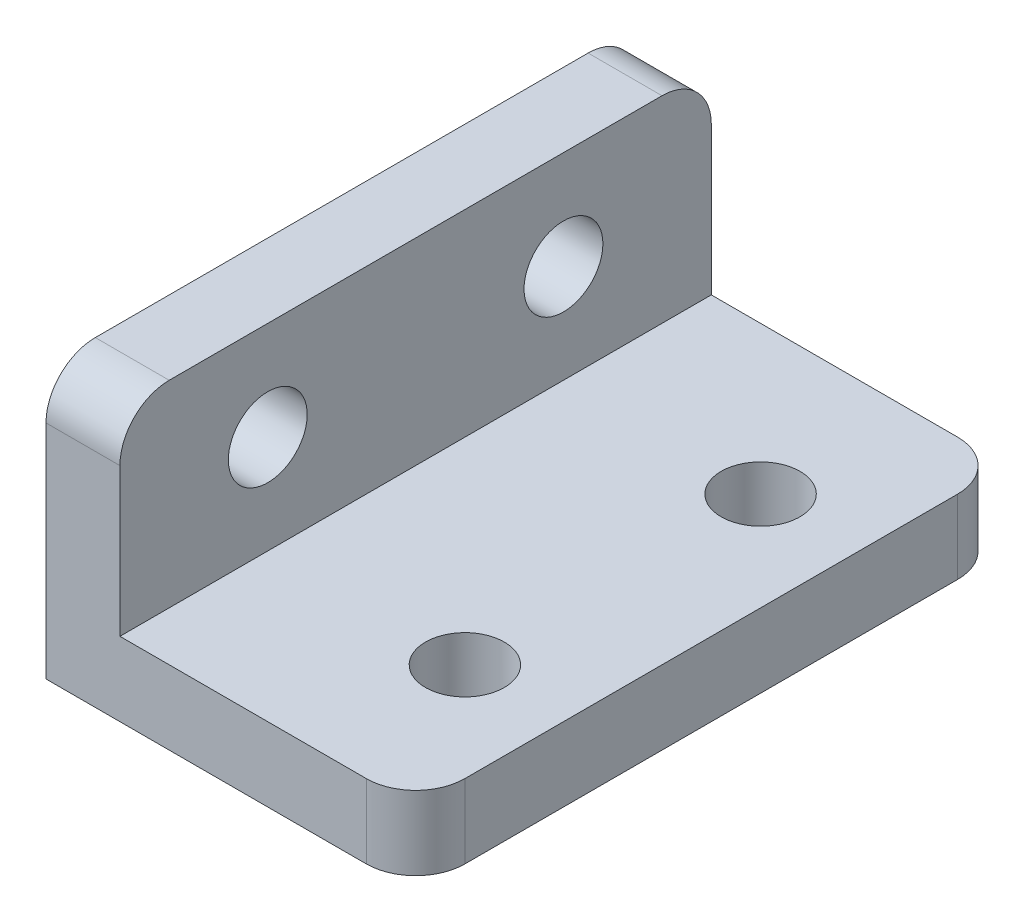
ISO-10303-21;
HEADER;
FILE_DESCRIPTION(('STEP AP214'),'2;1');
FILE_NAME('part.step','',(''),(''),'','','');
FILE_SCHEMA(('AUTOMOTIVE_DESIGN { 1 0 10303 214 1 1 1 1 }'));
ENDSEC;
DATA;
#1=APPLICATION_CONTEXT('core data for automotive mechanical design processes');
#2=APPLICATION_PROTOCOL_DEFINITION('international standard','automotive_design',2000,#1);
#3=PRODUCT_CONTEXT('',#1,'mechanical');
#4=PRODUCT('Part','Part','',(#3));
#5=PRODUCT_RELATED_PRODUCT_CATEGORY('part','',(#4));
#6=PRODUCT_DEFINITION_FORMATION('','',#4);
#7=PRODUCT_DEFINITION_CONTEXT('part definition',#1,'design');
#8=PRODUCT_DEFINITION('design','',#6,#7);
#9=PRODUCT_DEFINITION_SHAPE('','',#8);
#10=(LENGTH_UNIT() NAMED_UNIT(*) SI_UNIT(.MILLI.,.METRE.));
#11=(NAMED_UNIT(*) PLANE_ANGLE_UNIT() SI_UNIT($,.RADIAN.));
#12=(NAMED_UNIT(*) SI_UNIT($,.STERADIAN.) SOLID_ANGLE_UNIT());
#13=UNCERTAINTY_MEASURE_WITH_UNIT(LENGTH_MEASURE(1.E-05),#10,'distance_accuracy_value','');
#14=(GEOMETRIC_REPRESENTATION_CONTEXT(3) GLOBAL_UNCERTAINTY_ASSIGNED_CONTEXT((#13)) GLOBAL_UNIT_ASSIGNED_CONTEXT((#10,
#11,#12)) REPRESENTATION_CONTEXT('',''));
#15=CARTESIAN_POINT('',(0.,0.,0.));
#16=DIRECTION('',(0.,0.,1.));
#17=DIRECTION('',(1.,0.,0.));
#18=AXIS2_PLACEMENT_3D('',#15,#16,#17);
#19=CARTESIAN_POINT('',(9.40836507358763E-13,101.691622654979,-24.));
#20=DIRECTION('',(0.,-1.,0.));
#21=DIRECTION('',(1.,0.,0.));
#22=AXIS2_PLACEMENT_3D('',#19,#20,#21);
#23=PLANE('',#22);
#24=CARTESIAN_POINT('',(14.,101.691622654979,-6.));
#25=DIRECTION('',(0.,-1.,0.));
#26=DIRECTION('',(1.,0.,0.));
#27=AXIS2_PLACEMENT_3D('',#24,#25,#26);
#28=CIRCLE('',#27,1.60000000001785);
#29=CARTESIAN_POINT('',(15.6000000000178,101.691622654979,-6.));
#30=VERTEX_POINT('',#29);
#31=EDGE_CURVE('E382',#30,#30,#28,.T.);
#32=ORIENTED_EDGE('',*,*,#31,.F.);
#33=EDGE_LOOP('',(#32));
#34=FACE_BOUND('',#33,.T.);
#35=CARTESIAN_POINT('',(14.,101.691622654979,-18.));
#36=DIRECTION('',(0.,-1.,0.));
#37=DIRECTION('',(1.,0.,0.));
#38=AXIS2_PLACEMENT_3D('',#35,#36,#37);
#39=CIRCLE('',#38,1.60000000001785);
#40=CARTESIAN_POINT('',(15.6000000000178,101.691622654979,-18.));
#41=VERTEX_POINT('',#40);
#42=EDGE_CURVE('E387',#41,#41,#39,.T.);
#43=ORIENTED_EDGE('',*,*,#42,.F.);
#44=EDGE_LOOP('',(#43));
#45=FACE_BOUND('',#44,.T.);
#46=DIRECTION('',(1.,0.,0.));
#47=VECTOR('',#46,1.);
#48=CARTESIAN_POINT('',(9.40836507358763E-13,101.691622654979,-24.));
#49=LINE('',#48,#47);
#50=CARTESIAN_POINT('',(3.0000000000001,101.691622654979,-24.));
#51=VERTEX_POINT('',#50);
#52=CARTESIAN_POINT('',(16.,101.691622654979,-24.));
#53=VERTEX_POINT('',#52);
#54=EDGE_CURVE('E153',#51,#53,#49,.T.);
#55=ORIENTED_EDGE('',*,*,#54,.T.);
#56=CARTESIAN_POINT('',(16.,101.691622654979,-22.));
#57=DIRECTION('',(0.,-1.,0.));
#58=DIRECTION('',(1.,0.,0.));
#59=AXIS2_PLACEMENT_3D('',#56,#57,#58);
#60=CIRCLE('',#59,2.);
#61=CARTESIAN_POINT('',(18.,101.691622654979,-22.));
#62=VERTEX_POINT('',#61);
#63=EDGE_CURVE('E194',#53,#62,#60,.T.);
#64=ORIENTED_EDGE('',*,*,#63,.T.);
#65=DIRECTION('',(0.,0.,1.));
#66=VECTOR('',#65,1.);
#67=CARTESIAN_POINT('',(18.,101.691622654979,-24.));
#68=LINE('',#67,#66);
#69=CARTESIAN_POINT('',(18.,101.691622654979,-2.));
#70=VERTEX_POINT('',#69);
#71=EDGE_CURVE('E161',#62,#70,#68,.T.);
#72=ORIENTED_EDGE('',*,*,#71,.T.);
#73=CARTESIAN_POINT('',(16.,101.691622654979,-2.));
#74=DIRECTION('',(0.,-1.,0.));
#75=DIRECTION('',(1.,0.,0.));
#76=AXIS2_PLACEMENT_3D('',#73,#74,#75);
#77=CIRCLE('',#76,2.);
#78=CARTESIAN_POINT('',(16.,101.691622654979,0.));
#79=VERTEX_POINT('',#78);
#80=EDGE_CURVE('E192',#70,#79,#77,.T.);
#81=ORIENTED_EDGE('',*,*,#80,.T.);
#82=DIRECTION('',(1.,0.,0.));
#83=VECTOR('',#82,1.);
#84=CARTESIAN_POINT('',(9.40836507358763E-13,101.691622654979,0.));
#85=LINE('',#84,#83);
#86=CARTESIAN_POINT('',(3.0000000000001,101.691622654979,0.));
#87=VERTEX_POINT('',#86);
#88=EDGE_CURVE('E162',#87,#79,#85,.T.);
#89=ORIENTED_EDGE('',*,*,#88,.F.);
#90=DIRECTION('',(0.,0.,1.));
#91=VECTOR('',#90,1.);
#92=CARTESIAN_POINT('',(3.0000000000001,101.691622654979,-24.));
#93=LINE('',#92,#91);
#94=EDGE_CURVE('E170',#51,#87,#93,.T.);
#95=ORIENTED_EDGE('',*,*,#94,.F.);
#96=EDGE_LOOP('',(#55,#64,#72,#81,#89,#95));
#97=FACE_BOUND('',#96,.T.);
#98=ADVANCED_FACE('F49',(#34,#45,#97),#23,.T.);
#99=CARTESIAN_POINT('',(3.00000000000058,0.,-24.));
#100=DIRECTION('',(-1.,0.,0.));
#101=DIRECTION('',(0.,-1.,0.));
#102=AXIS2_PLACEMENT_3D('',#99,#100,#101);
#103=PLANE('',#102);
#104=CARTESIAN_POINT('',(3.00000000000007,108.691622654979,-6.));
#105=DIRECTION('',(-1.,0.,0.));
#106=DIRECTION('',(0.,-1.,0.));
#107=AXIS2_PLACEMENT_3D('',#104,#105,#106);
#108=CIRCLE('',#107,1.60000000000001);
#109=CARTESIAN_POINT('',(3.00000000000008,107.091622654979,-6.));
#110=VERTEX_POINT('',#109);
#111=EDGE_CURVE('E166',#110,#110,#108,.T.);
#112=ORIENTED_EDGE('',*,*,#111,.F.);
#113=EDGE_LOOP('',(#112));
#114=FACE_BOUND('',#113,.T.);
#115=CARTESIAN_POINT('',(3.00000000000007,108.691622654979,-18.));
#116=DIRECTION('',(-1.,0.,0.));
#117=DIRECTION('',(0.,-1.,0.));
#118=AXIS2_PLACEMENT_3D('',#115,#116,#117);
#119=CIRCLE('',#118,1.60000000000001);
#120=CARTESIAN_POINT('',(3.00000000000008,107.091622654979,-18.));
#121=VERTEX_POINT('',#120);
#122=EDGE_CURVE('E384',#121,#121,#119,.T.);
#123=ORIENTED_EDGE('',*,*,#122,.F.);
#124=EDGE_LOOP('',(#123));
#125=FACE_BOUND('',#124,.T.);
#126=DIRECTION('',(0.,0.,1.));
#127=VECTOR('',#126,1.);
#128=CARTESIAN_POINT('',(3.00000000000005,112.691622654979,-24.));
#129=LINE('',#128,#127);
#130=CARTESIAN_POINT('',(3.00000000000005,112.691622654979,-22.));
#131=VERTEX_POINT('',#130);
#132=CARTESIAN_POINT('',(3.00000000000005,112.691622654979,-2.));
#133=VERTEX_POINT('',#132);
#134=EDGE_CURVE('E174',#131,#133,#129,.T.);
#135=ORIENTED_EDGE('',*,*,#134,.F.);
#136=CARTESIAN_POINT('',(3.00000000000006,110.691622654979,-22.));
#137=DIRECTION('',(-1.,0.,0.));
#138=DIRECTION('',(0.,-1.,0.));
#139=AXIS2_PLACEMENT_3D('',#136,#137,#138);
#140=CIRCLE('',#139,2.);
#141=CARTESIAN_POINT('',(3.00000000000006,110.691622654979,-24.));
#142=VERTEX_POINT('',#141);
#143=EDGE_CURVE('E13',#131,#142,#140,.T.);
#144=ORIENTED_EDGE('',*,*,#143,.T.);
#145=DIRECTION('',(0.,-1.,0.));
#146=VECTOR('',#145,1.);
#147=CARTESIAN_POINT('',(3.00000000000058,0.,-24.));
#148=LINE('',#147,#146);
#149=EDGE_CURVE('E137',#142,#51,#148,.T.);
#150=ORIENTED_EDGE('',*,*,#149,.T.);
#151=ORIENTED_EDGE('',*,*,#94,.T.);
#152=DIRECTION('',(0.,-1.,0.));
#153=VECTOR('',#152,1.);
#154=CARTESIAN_POINT('',(3.00000000000058,0.,0.));
#155=LINE('',#154,#153);
#156=CARTESIAN_POINT('',(3.00000000000006,110.691622654979,0.));
#157=VERTEX_POINT('',#156);
#158=EDGE_CURVE('E156',#157,#87,#155,.T.);
#159=ORIENTED_EDGE('',*,*,#158,.F.);
#160=CARTESIAN_POINT('',(3.00000000000006,110.691622654979,-2.));
#161=DIRECTION('',(-1.,0.,0.));
#162=DIRECTION('',(0.,-1.,0.));
#163=AXIS2_PLACEMENT_3D('',#160,#161,#162);
#164=CIRCLE('',#163,2.);
#165=EDGE_CURVE('E57',#157,#133,#164,.T.);
#166=ORIENTED_EDGE('',*,*,#165,.T.);
#167=EDGE_LOOP('',(#135,#144,#150,#151,#159,#166));
#168=FACE_BOUND('',#167,.T.);
#169=ADVANCED_FACE('F214',(#114,#125,#168),#103,.T.);
#170=CARTESIAN_POINT('',(0.,112.691622654979,-24.));
#171=DIRECTION('',(0.,-1.,0.));
#172=DIRECTION('',(0.,0.,-1.));
#173=AXIS2_PLACEMENT_3D('',#170,#171,#172);
#174=PLANE('',#173);
#175=DIRECTION('',(0.,0.,1.));
#176=VECTOR('',#175,1.);
#177=CARTESIAN_POINT('',(6.00000000000005,112.691622654979,-24.));
#178=LINE('',#177,#176);
#179=CARTESIAN_POINT('',(6.00000000000005,112.691622654979,-22.));
#180=VERTEX_POINT('',#179);
#181=CARTESIAN_POINT('',(6.00000000000005,112.691622654979,-2.));
#182=VERTEX_POINT('',#181);
#183=EDGE_CURVE('E147',#180,#182,#178,.T.);
#184=ORIENTED_EDGE('',*,*,#183,.F.);
#185=DIRECTION('',(1.,0.,0.));
#186=VECTOR('',#185,1.);
#187=CARTESIAN_POINT('',(0.,112.691622654979,-22.));
#188=LINE('',#187,#186);
#189=EDGE_CURVE('E70',#180,#131,#188,.F.);
#190=ORIENTED_EDGE('',*,*,#189,.T.);
#191=ORIENTED_EDGE('',*,*,#134,.T.);
#192=DIRECTION('',(1.,0.,0.));
#193=VECTOR('',#192,1.);
#194=CARTESIAN_POINT('',(6.00000000000005,112.691622654979,-2.));
#195=LINE('',#194,#193);
#196=EDGE_CURVE('E205',#133,#182,#195,.T.);
#197=ORIENTED_EDGE('',*,*,#196,.T.);
#198=EDGE_LOOP('',(#184,#190,#191,#197));
#199=FACE_BOUND('',#198,.T.);
#200=ADVANCED_FACE('F209',(#199),#174,.F.);
#201=CARTESIAN_POINT('',(6.00000000000006,0.,-24.));
#202=DIRECTION('',(-1.,0.,0.));
#203=DIRECTION('',(0.,-1.,0.));
#204=AXIS2_PLACEMENT_3D('',#201,#202,#203);
#205=PLANE('',#204);
#206=CARTESIAN_POINT('',(6.00000000000005,108.691622654979,-6.));
#207=DIRECTION('',(1.,0.,0.));
#208=DIRECTION('',(0.,1.,0.));
#209=AXIS2_PLACEMENT_3D('',#206,#207,#208);
#210=CIRCLE('',#209,1.60000000000001);
#211=CARTESIAN_POINT('',(6.00000000000005,110.291622654979,-6.));
#212=VERTEX_POINT('',#211);
#213=EDGE_CURVE('E377',#212,#212,#210,.T.);
#214=ORIENTED_EDGE('',*,*,#213,.F.);
#215=EDGE_LOOP('',(#214));
#216=FACE_BOUND('',#215,.T.);
#217=CARTESIAN_POINT('',(6.00000000000005,108.691622654979,-18.));
#218=DIRECTION('',(1.,0.,0.));
#219=DIRECTION('',(0.,1.,0.));
#220=AXIS2_PLACEMENT_3D('',#217,#218,#219);
#221=CIRCLE('',#220,1.60000000000001);
#222=CARTESIAN_POINT('',(6.00000000000005,110.291622654979,-18.));
#223=VERTEX_POINT('',#222);
#224=EDGE_CURVE('E380',#223,#223,#221,.T.);
#225=ORIENTED_EDGE('',*,*,#224,.F.);
#226=EDGE_LOOP('',(#225));
#227=FACE_BOUND('',#226,.T.);
#228=DIRECTION('',(0.,-1.,0.));
#229=VECTOR('',#228,1.);
#230=CARTESIAN_POINT('',(6.00000000000006,0.,-24.));
#231=LINE('',#230,#229);
#232=CARTESIAN_POINT('',(6.00000000000005,110.691622654979,-24.));
#233=VERTEX_POINT('',#232);
#234=CARTESIAN_POINT('',(6.00000000000005,104.691622654979,-24.));
#235=VERTEX_POINT('',#234);
#236=EDGE_CURVE('E127',#233,#235,#231,.T.);
#237=ORIENTED_EDGE('',*,*,#236,.F.);
#238=CARTESIAN_POINT('',(6.00000000000005,110.691622654979,-22.));
#239=DIRECTION('',(-1.,0.,0.));
#240=DIRECTION('',(0.,-1.,0.));
#241=AXIS2_PLACEMENT_3D('',#238,#239,#240);
#242=CIRCLE('',#241,2.);
#243=EDGE_CURVE('E203',#233,#180,#242,.F.);
#244=ORIENTED_EDGE('',*,*,#243,.T.);
#245=ORIENTED_EDGE('',*,*,#183,.T.);
#246=CARTESIAN_POINT('',(6.00000000000005,110.691622654979,-2.));
#247=DIRECTION('',(-1.,0.,0.));
#248=DIRECTION('',(0.,-1.,0.));
#249=AXIS2_PLACEMENT_3D('',#246,#247,#248);
#250=CIRCLE('',#249,2.);
#251=CARTESIAN_POINT('',(6.00000000000005,110.691622654979,0.));
#252=VERTEX_POINT('',#251);
#253=EDGE_CURVE('E201',#182,#252,#250,.F.);
#254=ORIENTED_EDGE('',*,*,#253,.T.);
#255=DIRECTION('',(0.,-1.,0.));
#256=VECTOR('',#255,1.);
#257=CARTESIAN_POINT('',(6.00000000000006,0.,0.));
#258=LINE('',#257,#256);
#259=CARTESIAN_POINT('',(6.00000000000005,104.691622654979,0.));
#260=VERTEX_POINT('',#259);
#261=EDGE_CURVE('E143',#252,#260,#258,.T.);
#262=ORIENTED_EDGE('',*,*,#261,.T.);
#263=DIRECTION('',(0.,0.,1.));
#264=VECTOR('',#263,1.);
#265=CARTESIAN_POINT('',(6.00000000000005,104.691622654979,-24.));
#266=LINE('',#265,#264);
#267=EDGE_CURVE('E140',#235,#260,#266,.T.);
#268=ORIENTED_EDGE('',*,*,#267,.F.);
#269=EDGE_LOOP('',(#237,#244,#245,#254,#262,#268));
#270=FACE_BOUND('',#269,.T.);
#271=ADVANCED_FACE('F141',(#216,#227,#270),#205,.F.);
#272=CARTESIAN_POINT('',(0.,104.691622654979,-24.));
#273=DIRECTION('',(0.,-1.,0.));
#274=DIRECTION('',(0.,0.,-1.));
#275=AXIS2_PLACEMENT_3D('',#272,#273,#274);
#276=PLANE('',#275);
#277=CARTESIAN_POINT('',(14.,104.691622654979,-6.));
#278=DIRECTION('',(0.,1.,0.));
#279=DIRECTION('',(-1.,0.,0.));
#280=AXIS2_PLACEMENT_3D('',#277,#278,#279);
#281=CIRCLE('',#280,1.60000000001785);
#282=CARTESIAN_POINT('',(12.3999999999821,104.691622654979,-6.));
#283=VERTEX_POINT('',#282);
#284=EDGE_CURVE('E399',#283,#283,#281,.T.);
#285=ORIENTED_EDGE('',*,*,#284,.F.);
#286=EDGE_LOOP('',(#285));
#287=FACE_BOUND('',#286,.T.);
#288=CARTESIAN_POINT('',(14.,104.691622654979,-18.));
#289=DIRECTION('',(0.,1.,0.));
#290=DIRECTION('',(-1.,0.,0.));
#291=AXIS2_PLACEMENT_3D('',#288,#289,#290);
#292=CIRCLE('',#291,1.60000000001785);
#293=CARTESIAN_POINT('',(12.3999999999821,104.691622654979,-18.));
#294=VERTEX_POINT('',#293);
#295=EDGE_CURVE('E400',#294,#294,#292,.T.);
#296=ORIENTED_EDGE('',*,*,#295,.F.);
#297=EDGE_LOOP('',(#296));
#298=FACE_BOUND('',#297,.T.);
#299=DIRECTION('',(0.,0.,1.));
#300=VECTOR('',#299,1.);
#301=CARTESIAN_POINT('',(18.,104.691622654979,-24.));
#302=LINE('',#301,#300);
#303=CARTESIAN_POINT('',(18.,104.691622654979,-22.));
#304=VERTEX_POINT('',#303);
#305=CARTESIAN_POINT('',(18.,104.691622654979,-2.));
#306=VERTEX_POINT('',#305);
#307=EDGE_CURVE('E148',#304,#306,#302,.T.);
#308=ORIENTED_EDGE('',*,*,#307,.F.);
#309=CARTESIAN_POINT('',(16.,104.691622654979,-22.));
#310=DIRECTION('',(0.,-1.,0.));
#311=DIRECTION('',(0.,0.,-1.));
#312=AXIS2_PLACEMENT_3D('',#309,#310,#311);
#313=CIRCLE('',#312,2.);
#314=CARTESIAN_POINT('',(16.,104.691622654979,-24.));
#315=VERTEX_POINT('',#314);
#316=EDGE_CURVE('E152',#304,#315,#313,.F.);
#317=ORIENTED_EDGE('',*,*,#316,.T.);
#318=DIRECTION('',(1.,0.,0.));
#319=VECTOR('',#318,1.);
#320=CARTESIAN_POINT('',(0.,104.691622654979,-24.));
#321=LINE('',#320,#319);
#322=EDGE_CURVE('E131',#235,#315,#321,.T.);
#323=ORIENTED_EDGE('',*,*,#322,.F.);
#324=ORIENTED_EDGE('',*,*,#267,.T.);
#325=DIRECTION('',(1.,0.,0.));
#326=VECTOR('',#325,1.);
#327=CARTESIAN_POINT('',(0.,104.691622654979,0.));
#328=LINE('',#327,#326);
#329=CARTESIAN_POINT('',(16.,104.691622654979,0.));
#330=VERTEX_POINT('',#329);
#331=EDGE_CURVE('E165',#260,#330,#328,.T.);
#332=ORIENTED_EDGE('',*,*,#331,.T.);
#333=CARTESIAN_POINT('',(16.,104.691622654979,-2.));
#334=DIRECTION('',(0.,-1.,0.));
#335=DIRECTION('',(0.,0.,-1.));
#336=AXIS2_PLACEMENT_3D('',#333,#334,#335);
#337=CIRCLE('',#336,2.);
#338=EDGE_CURVE('E186',#330,#306,#337,.F.);
#339=ORIENTED_EDGE('',*,*,#338,.T.);
#340=EDGE_LOOP('',(#308,#317,#323,#324,#332,#339));
#341=FACE_BOUND('',#340,.T.);
#342=ADVANCED_FACE('F151',(#287,#298,#341),#276,.F.);
#343=CARTESIAN_POINT('',(18.,0.,-24.));
#344=DIRECTION('',(1.,0.,0.));
#345=DIRECTION('',(0.,0.,-1.));
#346=AXIS2_PLACEMENT_3D('',#343,#344,#345);
#347=PLANE('',#346);
#348=ORIENTED_EDGE('',*,*,#71,.F.);
#349=DIRECTION('',(0.,1.,0.));
#350=VECTOR('',#349,1.);
#351=CARTESIAN_POINT('',(18.,104.691622654979,-22.));
#352=LINE('',#351,#350);
#353=EDGE_CURVE('E183',#62,#304,#352,.T.);
#354=ORIENTED_EDGE('',*,*,#353,.T.);
#355=ORIENTED_EDGE('',*,*,#307,.T.);
#356=DIRECTION('',(0.,1.,0.));
#357=VECTOR('',#356,1.);
#358=CARTESIAN_POINT('',(18.,0.,-2.));
#359=LINE('',#358,#357);
#360=EDGE_CURVE('E173',#306,#70,#359,.F.);
#361=ORIENTED_EDGE('',*,*,#360,.T.);
#362=EDGE_LOOP('',(#348,#354,#355,#361));
#363=FACE_BOUND('',#362,.T.);
#364=ADVANCED_FACE('F225',(#363),#347,.T.);
#365=CARTESIAN_POINT('',(0.,0.,-24.));
#366=DIRECTION('',(0.,0.,1.));
#367=DIRECTION('',(1.,0.,0.));
#368=AXIS2_PLACEMENT_3D('',#365,#366,#367);
#369=PLANE('',#368);
#370=ORIENTED_EDGE('',*,*,#322,.T.);
#371=DIRECTION('',(0.,1.,0.));
#372=VECTOR('',#371,1.);
#373=CARTESIAN_POINT('',(16.,101.691622654979,-24.));
#374=LINE('',#373,#372);
#375=EDGE_CURVE('E190',#315,#53,#374,.F.);
#376=ORIENTED_EDGE('',*,*,#375,.T.);
#377=ORIENTED_EDGE('',*,*,#54,.F.);
#378=ORIENTED_EDGE('',*,*,#149,.F.);
#379=DIRECTION('',(1.,0.,0.));
#380=VECTOR('',#379,1.);
#381=CARTESIAN_POINT('',(0.,110.691622654979,-24.));
#382=LINE('',#381,#380);
#383=EDGE_CURVE('E135',#142,#233,#382,.T.);
#384=ORIENTED_EDGE('',*,*,#383,.T.);
#385=ORIENTED_EDGE('',*,*,#236,.T.);
#386=EDGE_LOOP('',(#370,#376,#377,#378,#384,#385));
#387=FACE_BOUND('',#386,.T.);
#388=ADVANCED_FACE('F129',(#387),#369,.F.);
#389=CARTESIAN_POINT('',(0.,0.,0.));
#390=DIRECTION('',(0.,0.,1.));
#391=DIRECTION('',(1.,0.,0.));
#392=AXIS2_PLACEMENT_3D('',#389,#390,#391);
#393=PLANE('',#392);
#394=ORIENTED_EDGE('',*,*,#88,.T.);
#395=DIRECTION('',(0.,1.,0.));
#396=VECTOR('',#395,1.);
#397=CARTESIAN_POINT('',(16.,0.,0.));
#398=LINE('',#397,#396);
#399=EDGE_CURVE('E198',#79,#330,#398,.T.);
#400=ORIENTED_EDGE('',*,*,#399,.T.);
#401=ORIENTED_EDGE('',*,*,#331,.F.);
#402=ORIENTED_EDGE('',*,*,#261,.F.);
#403=DIRECTION('',(1.,0.,0.));
#404=VECTOR('',#403,1.);
#405=CARTESIAN_POINT('',(3.00000000000005,110.691622654979,0.));
#406=LINE('',#405,#404);
#407=EDGE_CURVE('E196',#252,#157,#406,.F.);
#408=ORIENTED_EDGE('',*,*,#407,.T.);
#409=ORIENTED_EDGE('',*,*,#158,.T.);
#410=EDGE_LOOP('',(#394,#400,#401,#402,#408,#409));
#411=FACE_BOUND('',#410,.T.);
#412=ADVANCED_FACE('F232',(#411),#393,.T.);
#413=CARTESIAN_POINT('',(-18.,108.691622654979,-18.));
#414=DIRECTION('',(1.,0.,0.));
#415=DIRECTION('',(0.,1.,0.));
#416=AXIS2_PLACEMENT_3D('',#413,#414,#415);
#417=CYLINDRICAL_SURFACE('',#416,1.60000000000001);
#418=ORIENTED_EDGE('',*,*,#122,.T.);
#419=EDGE_LOOP('',(#418));
#420=FACE_BOUND('',#419,.T.);
#421=ORIENTED_EDGE('',*,*,#224,.T.);
#422=EDGE_LOOP('',(#421));
#423=FACE_BOUND('',#422,.T.);
#424=ADVANCED_FACE('F302',(#420,#423),#417,.F.);
#425=CARTESIAN_POINT('',(-18.,108.691622654979,-6.));
#426=DIRECTION('',(1.,0.,0.));
#427=DIRECTION('',(0.,1.,0.));
#428=AXIS2_PLACEMENT_3D('',#425,#426,#427);
#429=CYLINDRICAL_SURFACE('',#428,1.60000000000001);
#430=ORIENTED_EDGE('',*,*,#111,.T.);
#431=EDGE_LOOP('',(#430));
#432=FACE_BOUND('',#431,.T.);
#433=ORIENTED_EDGE('',*,*,#213,.T.);
#434=EDGE_LOOP('',(#433));
#435=FACE_BOUND('',#434,.T.);
#436=ADVANCED_FACE('F293',(#432,#435),#429,.F.);
#437=CARTESIAN_POINT('',(14.,80.6916226549791,-18.));
#438=DIRECTION('',(0.,1.,0.));
#439=DIRECTION('',(-1.,0.,0.));
#440=AXIS2_PLACEMENT_3D('',#437,#438,#439);
#441=CYLINDRICAL_SURFACE('',#440,1.60000000001785);
#442=ORIENTED_EDGE('',*,*,#42,.T.);
#443=EDGE_LOOP('',(#442));
#444=FACE_BOUND('',#443,.T.);
#445=ORIENTED_EDGE('',*,*,#295,.T.);
#446=EDGE_LOOP('',(#445));
#447=FACE_BOUND('',#446,.T.);
#448=ADVANCED_FACE('F284',(#444,#447),#441,.F.);
#449=CARTESIAN_POINT('',(14.,80.6916226549791,-6.));
#450=DIRECTION('',(0.,1.,0.));
#451=DIRECTION('',(-1.,0.,0.));
#452=AXIS2_PLACEMENT_3D('',#449,#450,#451);
#453=CYLINDRICAL_SURFACE('',#452,1.60000000001785);
#454=ORIENTED_EDGE('',*,*,#31,.T.);
#455=EDGE_LOOP('',(#454));
#456=FACE_BOUND('',#455,.T.);
#457=ORIENTED_EDGE('',*,*,#284,.T.);
#458=EDGE_LOOP('',(#457));
#459=FACE_BOUND('',#458,.T.);
#460=ADVANCED_FACE('F253',(#456,#459),#453,.F.);
#461=CARTESIAN_POINT('',(16.,0.,-22.));
#462=DIRECTION('',(0.,-1.,0.));
#463=DIRECTION('',(0.,0.,-1.));
#464=AXIS2_PLACEMENT_3D('',#461,#462,#463);
#465=CYLINDRICAL_SURFACE('',#464,2.);
#466=ORIENTED_EDGE('',*,*,#63,.F.);
#467=ORIENTED_EDGE('',*,*,#375,.F.);
#468=ORIENTED_EDGE('',*,*,#316,.F.);
#469=ORIENTED_EDGE('',*,*,#353,.F.);
#470=EDGE_LOOP('',(#466,#467,#468,#469));
#471=FACE_BOUND('',#470,.T.);
#472=ADVANCED_FACE('F223',(#471),#465,.T.);
#473=CARTESIAN_POINT('',(16.,0.,-2.));
#474=DIRECTION('',(0.,1.,0.));
#475=DIRECTION('',(0.,0.,1.));
#476=AXIS2_PLACEMENT_3D('',#473,#474,#475);
#477=CYLINDRICAL_SURFACE('',#476,2.);
#478=ORIENTED_EDGE('',*,*,#80,.F.);
#479=ORIENTED_EDGE('',*,*,#360,.F.);
#480=ORIENTED_EDGE('',*,*,#338,.F.);
#481=ORIENTED_EDGE('',*,*,#399,.F.);
#482=EDGE_LOOP('',(#478,#479,#480,#481));
#483=FACE_BOUND('',#482,.T.);
#484=ADVANCED_FACE('F230',(#483),#477,.T.);
#485=CARTESIAN_POINT('',(0.,110.691622654979,-22.));
#486=DIRECTION('',(1.,0.,0.));
#487=DIRECTION('',(0.,0.,-1.));
#488=AXIS2_PLACEMENT_3D('',#485,#486,#487);
#489=CYLINDRICAL_SURFACE('',#488,2.);
#490=ORIENTED_EDGE('',*,*,#143,.F.);
#491=ORIENTED_EDGE('',*,*,#189,.F.);
#492=ORIENTED_EDGE('',*,*,#243,.F.);
#493=ORIENTED_EDGE('',*,*,#383,.F.);
#494=EDGE_LOOP('',(#490,#491,#492,#493));
#495=FACE_BOUND('',#494,.T.);
#496=ADVANCED_FACE('F213',(#495),#489,.T.);
#497=CARTESIAN_POINT('',(0.,110.691622654979,-2.));
#498=DIRECTION('',(-1.,0.,0.));
#499=DIRECTION('',(0.,0.,1.));
#500=AXIS2_PLACEMENT_3D('',#497,#498,#499);
#501=CYLINDRICAL_SURFACE('',#500,2.);
#502=ORIENTED_EDGE('',*,*,#165,.F.);
#503=ORIENTED_EDGE('',*,*,#407,.F.);
#504=ORIENTED_EDGE('',*,*,#253,.F.);
#505=ORIENTED_EDGE('',*,*,#196,.F.);
#506=EDGE_LOOP('',(#502,#503,#504,#505));
#507=FACE_BOUND('',#506,.T.);
#508=ADVANCED_FACE('F51',(#507),#501,.T.);
#509=CLOSED_SHELL('',(#98,#169,#200,#271,#342,#364,#388,#412,#424,#436,#448,#460,#472,#484,#496,#508));
#510=MANIFOLD_SOLID_BREP('B2',#509);
#511=ADVANCED_BREP_SHAPE_REPRESENTATION('',(#18,#510),#14);
#512=SHAPE_DEFINITION_REPRESENTATION(#9,#511);
ENDSEC;
END-ISO-10303-21;
